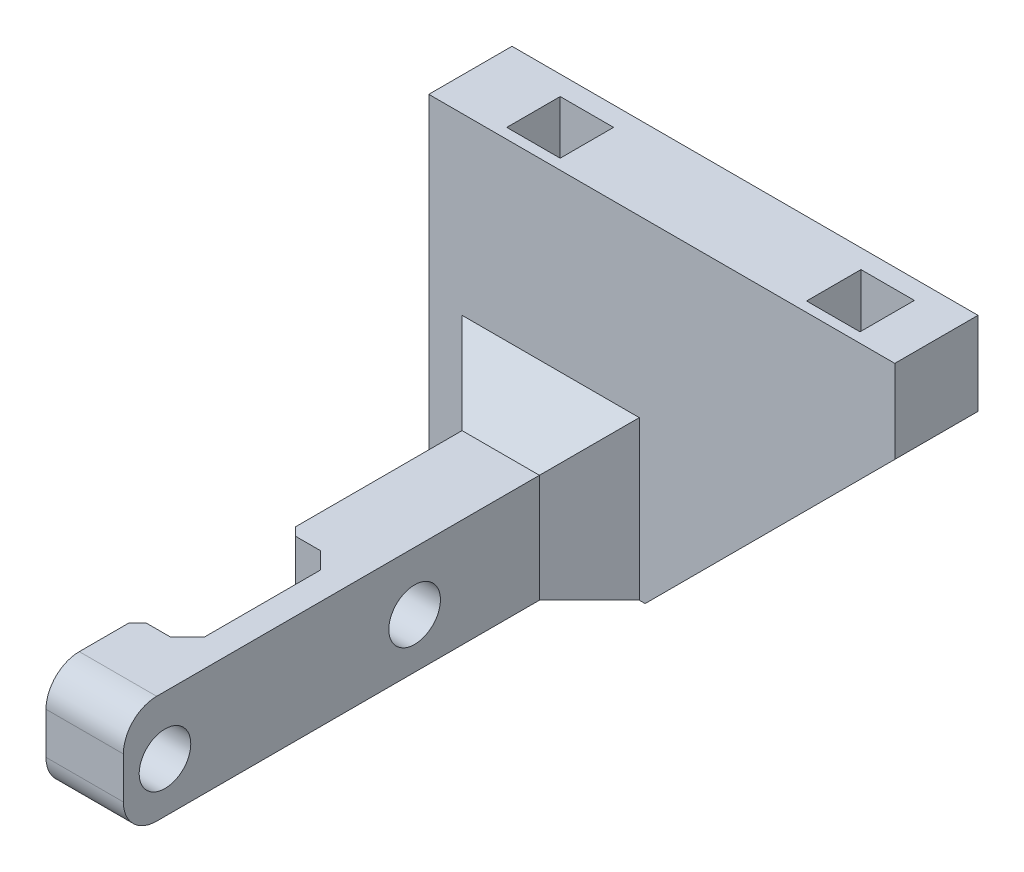
ISO-10303-21;
HEADER;
FILE_DESCRIPTION(('STEP AP214'),'2;1');
FILE_NAME('part.step','',(''),(''),'','','');
FILE_SCHEMA(('AUTOMOTIVE_DESIGN { 1 0 10303 214 1 1 1 1 }'));
ENDSEC;
DATA;
#1=APPLICATION_CONTEXT('core data for automotive mechanical design processes');
#2=APPLICATION_PROTOCOL_DEFINITION('international standard','automotive_design',2000,#1);
#3=PRODUCT_CONTEXT('',#1,'mechanical');
#4=PRODUCT('Part','Part','',(#3));
#5=PRODUCT_RELATED_PRODUCT_CATEGORY('part','',(#4));
#6=PRODUCT_DEFINITION_FORMATION('','',#4);
#7=PRODUCT_DEFINITION_CONTEXT('part definition',#1,'design');
#8=PRODUCT_DEFINITION('design','',#6,#7);
#9=PRODUCT_DEFINITION_SHAPE('','',#8);
#10=(LENGTH_UNIT() NAMED_UNIT(*) SI_UNIT(.MILLI.,.METRE.));
#11=(NAMED_UNIT(*) PLANE_ANGLE_UNIT() SI_UNIT($,.RADIAN.));
#12=(NAMED_UNIT(*) SI_UNIT($,.STERADIAN.) SOLID_ANGLE_UNIT());
#13=UNCERTAINTY_MEASURE_WITH_UNIT(LENGTH_MEASURE(1.E-05),#10,'distance_accuracy_value','');
#14=(GEOMETRIC_REPRESENTATION_CONTEXT(3) GLOBAL_UNCERTAINTY_ASSIGNED_CONTEXT((#13)) GLOBAL_UNIT_ASSIGNED_CONTEXT((#10,
#11,#12)) REPRESENTATION_CONTEXT('',''));
#15=CARTESIAN_POINT('',(0.,0.,0.));
#16=DIRECTION('',(0.,0.,1.));
#17=DIRECTION('',(1.,0.,0.));
#18=AXIS2_PLACEMENT_3D('',#15,#16,#17);
#19=CARTESIAN_POINT('',(0.,20.,0.));
#20=DIRECTION('',(0.,-1.,0.));
#21=DIRECTION('',(0.,0.,-1.));
#22=AXIS2_PLACEMENT_3D('',#19,#20,#21);
#23=PLANE('',#22);
#24=DIRECTION('',(0.,0.,-1.));
#25=VECTOR('',#24,1.);
#26=CARTESIAN_POINT('',(7.27200254201889,20.,0.));
#27=LINE('',#26,#25);
#28=CARTESIAN_POINT('',(7.27200254201889,20.,-0.621999824792119));
#29=VERTEX_POINT('',#28);
#30=CARTESIAN_POINT('',(7.27200254201889,20.,-3.831999980472));
#31=VERTEX_POINT('',#30);
#32=EDGE_CURVE('E257',#29,#31,#27,.T.);
#33=ORIENTED_EDGE('',*,*,#32,.F.);
#34=DIRECTION('',(1.,0.,0.));
#35=VECTOR('',#34,1.);
#36=CARTESIAN_POINT('',(0.,20.,-0.621999824792119));
#37=LINE('',#36,#35);
#38=CARTESIAN_POINT('',(4.06400368213654,20.,-0.621999824792119));
#39=VERTEX_POINT('',#38);
#40=EDGE_CURVE('E52',#39,#29,#37,.T.);
#41=ORIENTED_EDGE('',*,*,#40,.F.);
#42=DIRECTION('',(0.,0.,-1.));
#43=VECTOR('',#42,1.);
#44=CARTESIAN_POINT('',(4.06400368213654,20.,0.));
#45=LINE('',#44,#43);
#46=CARTESIAN_POINT('',(4.06400368213654,20.,-3.831999980472));
#47=VERTEX_POINT('',#46);
#48=EDGE_CURVE('E248',#39,#47,#45,.T.);
#49=ORIENTED_EDGE('',*,*,#48,.T.);
#50=DIRECTION('',(1.,0.,0.));
#51=VECTOR('',#50,1.);
#52=CARTESIAN_POINT('',(0.,20.,-3.831999980472));
#53=LINE('',#52,#51);
#54=EDGE_CURVE('E251',#47,#31,#53,.T.);
#55=ORIENTED_EDGE('',*,*,#54,.T.);
#56=EDGE_LOOP('',(#33,#41,#49,#55));
#57=FACE_BOUND('',#56,.T.);
#58=DIRECTION('',(0.,0.,1.));
#59=VECTOR('',#58,1.);
#60=CARTESIAN_POINT('',(0.,20.,0.));
#61=LINE('',#60,#59);
#62=CARTESIAN_POINT('',(0.,20.,-5.));
#63=VERTEX_POINT('',#62);
#64=CARTESIAN_POINT('',(0.,20.,0.));
#65=VERTEX_POINT('',#64);
#66=EDGE_CURVE('E338',#63,#65,#61,.T.);
#67=ORIENTED_EDGE('',*,*,#66,.T.);
#68=DIRECTION('',(1.,0.,0.));
#69=VECTOR('',#68,1.);
#70=CARTESIAN_POINT('',(0.,20.,0.));
#71=LINE('',#70,#69);
#72=CARTESIAN_POINT('',(28.,20.,0.));
#73=VERTEX_POINT('',#72);
#74=EDGE_CURVE('E341',#65,#73,#71,.T.);
#75=ORIENTED_EDGE('',*,*,#74,.T.);
#76=DIRECTION('',(0.,0.,-1.));
#77=VECTOR('',#76,1.);
#78=CARTESIAN_POINT('',(28.,20.,0.));
#79=LINE('',#78,#77);
#80=CARTESIAN_POINT('',(28.,20.,-5.));
#81=VERTEX_POINT('',#80);
#82=EDGE_CURVE('E344',#73,#81,#79,.T.);
#83=ORIENTED_EDGE('',*,*,#82,.T.);
#84=DIRECTION('',(-1.,0.,0.));
#85=VECTOR('',#84,1.);
#86=CARTESIAN_POINT('',(0.,20.,-5.));
#87=LINE('',#86,#85);
#88=EDGE_CURVE('E346',#81,#63,#87,.T.);
#89=ORIENTED_EDGE('',*,*,#88,.T.);
#90=EDGE_LOOP('',(#67,#75,#83,#89));
#91=FACE_BOUND('',#90,.T.);
#92=DIRECTION('',(0.,0.,-1.));
#93=VECTOR('',#92,1.);
#94=CARTESIAN_POINT('',(22.104005074501,20.,0.));
#95=LINE('',#94,#93);
#96=CARTESIAN_POINT('',(22.104005074501,20.,-0.595999626815291));
#97=VERTEX_POINT('',#96);
#98=CARTESIAN_POINT('',(22.104005074501,20.,-3.86399987488982));
#99=VERTEX_POINT('',#98);
#100=EDGE_CURVE('E60',#97,#99,#95,.T.);
#101=ORIENTED_EDGE('',*,*,#100,.T.);
#102=DIRECTION('',(-1.,0.,0.));
#103=VECTOR('',#102,1.);
#104=CARTESIAN_POINT('',(0.,20.,-3.86399987488982));
#105=LINE('',#104,#103);
#106=CARTESIAN_POINT('',(25.3140006899834,20.,-3.86399987488982));
#107=VERTEX_POINT('',#106);
#108=EDGE_CURVE('E271',#107,#99,#105,.T.);
#109=ORIENTED_EDGE('',*,*,#108,.F.);
#110=DIRECTION('',(0.,0.,-1.));
#111=VECTOR('',#110,1.);
#112=CARTESIAN_POINT('',(25.3140006899834,20.,0.));
#113=LINE('',#112,#111);
#114=CARTESIAN_POINT('',(25.3140006899834,20.,-0.595999626815292));
#115=VERTEX_POINT('',#114);
#116=EDGE_CURVE('E284',#115,#107,#113,.T.);
#117=ORIENTED_EDGE('',*,*,#116,.F.);
#118=DIRECTION('',(-1.,0.,0.));
#119=VECTOR('',#118,1.);
#120=CARTESIAN_POINT('',(0.,20.,-0.595999626815288));
#121=LINE('',#120,#119);
#122=EDGE_CURVE('E281',#115,#97,#121,.T.);
#123=ORIENTED_EDGE('',*,*,#122,.T.);
#124=EDGE_LOOP('',(#101,#109,#117,#123));
#125=FACE_BOUND('',#124,.T.);
#126=ADVANCED_FACE('F36',(#57,#91,#125),#23,.F.);
#127=CARTESIAN_POINT('',(5.,0.,28.));
#128=DIRECTION('',(1.,0.,0.));
#129=DIRECTION('',(0.,0.,-1.));
#130=AXIS2_PLACEMENT_3D('',#127,#128,#129);
#131=PLANE('',#130);
#132=CARTESIAN_POINT('',(5.,2.99999999999998,25.5));
#133=DIRECTION('',(-1.,0.,0.));
#134=DIRECTION('',(0.,0.,1.));
#135=AXIS2_PLACEMENT_3D('',#132,#133,#134);
#136=CIRCLE('',#135,1.55);
#137=CARTESIAN_POINT('',(5.,2.99999999999998,27.05));
#138=VERTEX_POINT('',#137);
#139=EDGE_CURVE('E295',#138,#138,#136,.T.);
#140=ORIENTED_EDGE('',*,*,#139,.F.);
#141=EDGE_LOOP('',(#140));
#142=FACE_BOUND('',#141,.T.);
#143=DIRECTION('',(0.,0.,-1.));
#144=VECTOR('',#143,1.);
#145=CARTESIAN_POINT('',(5.,6.5,28.));
#146=LINE('',#145,#144);
#147=CARTESIAN_POINT('',(5.,6.5,26.));
#148=VERTEX_POINT('',#147);
#149=CARTESIAN_POINT('',(5.,6.5,23.));
#150=VERTEX_POINT('',#149);
#151=EDGE_CURVE('E331',#148,#150,#146,.T.);
#152=ORIENTED_EDGE('',*,*,#151,.T.);
#153=DIRECTION('',(0.,-1.,0.));
#154=VECTOR('',#153,1.);
#155=CARTESIAN_POINT('',(5.,0.,23.));
#156=LINE('',#155,#154);
#157=CARTESIAN_POINT('',(5.00000000000001,0.,23.));
#158=VERTEX_POINT('',#157);
#159=EDGE_CURVE('E418',#150,#158,#156,.T.);
#160=ORIENTED_EDGE('',*,*,#159,.T.);
#161=DIRECTION('',(0.,0.,-1.));
#162=VECTOR('',#161,1.);
#163=CARTESIAN_POINT('',(5.00000000000001,0.,28.));
#164=LINE('',#163,#162);
#165=CARTESIAN_POINT('',(5.00000000000001,0.,26.));
#166=VERTEX_POINT('',#165);
#167=EDGE_CURVE('E327',#166,#158,#164,.T.);
#168=ORIENTED_EDGE('',*,*,#167,.F.);
#169=CARTESIAN_POINT('',(5.,2.,26.));
#170=DIRECTION('',(1.,0.,0.));
#171=DIRECTION('',(0.,0.,-1.));
#172=AXIS2_PLACEMENT_3D('',#169,#170,#171);
#173=CIRCLE('',#172,2.);
#174=CARTESIAN_POINT('',(5.,2.,28.));
#175=VERTEX_POINT('',#174);
#176=EDGE_CURVE('E412',#166,#175,#173,.F.);
#177=ORIENTED_EDGE('',*,*,#176,.T.);
#178=DIRECTION('',(0.,-1.,0.));
#179=VECTOR('',#178,1.);
#180=CARTESIAN_POINT('',(5.,0.,28.));
#181=LINE('',#180,#179);
#182=CARTESIAN_POINT('',(5.,4.5,28.));
#183=VERTEX_POINT('',#182);
#184=EDGE_CURVE('E320',#183,#175,#181,.T.);
#185=ORIENTED_EDGE('',*,*,#184,.F.);
#186=CARTESIAN_POINT('',(5.,4.5,26.));
#187=DIRECTION('',(1.,0.,0.));
#188=DIRECTION('',(0.,0.,-1.));
#189=AXIS2_PLACEMENT_3D('',#186,#187,#188);
#190=CIRCLE('',#189,2.);
#191=EDGE_CURVE('E414',#183,#148,#190,.F.);
#192=ORIENTED_EDGE('',*,*,#191,.T.);
#193=EDGE_LOOP('',(#152,#160,#168,#177,#185,#192));
#194=FACE_BOUND('',#193,.T.);
#195=ADVANCED_FACE('F517',(#142,#194),#131,.F.);
#196=CARTESIAN_POINT('',(0.,20.,0.));
#197=DIRECTION('',(1.,0.,0.));
#198=DIRECTION('',(0.,0.,-1.));
#199=AXIS2_PLACEMENT_3D('',#196,#197,#198);
#200=PLANE('',#199);
#201=DIRECTION('',(0.,0.,1.));
#202=VECTOR('',#201,1.);
#203=CARTESIAN_POINT('',(0.,0.,0.));
#204=LINE('',#203,#202);
#205=CARTESIAN_POINT('',(0.,0.,-5.));
#206=VERTEX_POINT('',#205);
#207=CARTESIAN_POINT('',(0.,0.,0.));
#208=VERTEX_POINT('',#207);
#209=EDGE_CURVE('E337',#206,#208,#204,.T.);
#210=ORIENTED_EDGE('',*,*,#209,.T.);
#211=DIRECTION('',(0.,-1.,0.));
#212=VECTOR('',#211,1.);
#213=CARTESIAN_POINT('',(0.,20.,0.));
#214=LINE('',#213,#212);
#215=EDGE_CURVE('E364',#65,#208,#214,.T.);
#216=ORIENTED_EDGE('',*,*,#215,.F.);
#217=ORIENTED_EDGE('',*,*,#66,.F.);
#218=DIRECTION('',(0.,-1.,0.));
#219=VECTOR('',#218,1.);
#220=CARTESIAN_POINT('',(0.,20.,-5.));
#221=LINE('',#220,#219);
#222=EDGE_CURVE('E348',#63,#206,#221,.T.);
#223=ORIENTED_EDGE('',*,*,#222,.T.);
#224=EDGE_LOOP('',(#210,#216,#217,#223));
#225=FACE_BOUND('',#224,.T.);
#226=ADVANCED_FACE('F546',(#225),#200,.F.);
#227=CARTESIAN_POINT('',(0.,20.,0.));
#228=DIRECTION('',(0.,0.,-1.));
#229=DIRECTION('',(-1.,0.,0.));
#230=AXIS2_PLACEMENT_3D('',#227,#228,#229);
#231=PLANE('',#230);
#232=DIRECTION('',(1.,0.,0.));
#233=VECTOR('',#232,1.);
#234=CARTESIAN_POINT('',(0.,9.50000000000002,0.));
#235=LINE('',#234,#233);
#236=CARTESIAN_POINT('',(2.00000000000002,9.50000000000002,0.));
#237=VERTEX_POINT('',#236);
#238=CARTESIAN_POINT('',(12.6487572971,9.50000000000002,0.));
#239=VERTEX_POINT('',#238);
#240=EDGE_CURVE('E453',#237,#239,#235,.T.);
#241=ORIENTED_EDGE('',*,*,#240,.T.);
#242=DIRECTION('',(0.,-1.,0.));
#243=VECTOR('',#242,1.);
#244=CARTESIAN_POINT('',(12.6487572971,20.,0.));
#245=LINE('',#244,#243);
#246=CARTESIAN_POINT('',(12.6487572971,0.,0.));
#247=VERTEX_POINT('',#246);
#248=EDGE_CURVE('E441',#239,#247,#245,.T.);
#249=ORIENTED_EDGE('',*,*,#248,.T.);
#250=DIRECTION('',(1.,0.,0.));
#251=VECTOR('',#250,1.);
#252=CARTESIAN_POINT('',(0.,0.,0.));
#253=LINE('',#252,#251);
#254=CARTESIAN_POINT('',(13.,0.,0.));
#255=VERTEX_POINT('',#254);
#256=EDGE_CURVE('E351',#247,#255,#253,.T.);
#257=ORIENTED_EDGE('',*,*,#256,.T.);
#258=DIRECTION('',(0.707106781186549,0.707106781186546,0.));
#259=VECTOR('',#258,1.);
#260=CARTESIAN_POINT('',(28.,15.,0.));
#261=LINE('',#260,#259);
#262=CARTESIAN_POINT('',(28.,15.,0.));
#263=VERTEX_POINT('',#262);
#264=EDGE_CURVE('E375',#255,#263,#261,.T.);
#265=ORIENTED_EDGE('',*,*,#264,.T.);
#266=DIRECTION('',(0.,-1.,0.));
#267=VECTOR('',#266,1.);
#268=CARTESIAN_POINT('',(28.,20.,0.));
#269=LINE('',#268,#267);
#270=EDGE_CURVE('E361',#73,#263,#269,.T.);
#271=ORIENTED_EDGE('',*,*,#270,.F.);
#272=ORIENTED_EDGE('',*,*,#74,.F.);
#273=ORIENTED_EDGE('',*,*,#215,.T.);
#274=CARTESIAN_POINT('',(2.00000000000002,0.,0.));
#275=VERTEX_POINT('',#274);
#276=EDGE_CURVE('E352',#208,#275,#253,.T.);
#277=ORIENTED_EDGE('',*,*,#276,.T.);
#278=DIRECTION('',(0.,1.,0.));
#279=VECTOR('',#278,1.);
#280=CARTESIAN_POINT('',(2.00000000000002,6.5,0.));
#281=LINE('',#280,#279);
#282=EDGE_CURVE('E444',#275,#237,#281,.T.);
#283=ORIENTED_EDGE('',*,*,#282,.T.);
#284=EDGE_LOOP('',(#241,#249,#257,#265,#271,#272,#273,#277,#283));
#285=FACE_BOUND('',#284,.T.);
#286=ADVANCED_FACE('F563',(#285),#231,.F.);
#287=CARTESIAN_POINT('',(28.,20.,0.));
#288=DIRECTION('',(-1.,0.,0.));
#289=DIRECTION('',(0.,0.,1.));
#290=AXIS2_PLACEMENT_3D('',#287,#288,#289);
#291=PLANE('',#290);
#292=ORIENTED_EDGE('',*,*,#270,.T.);
#293=DIRECTION('',(0.,0.,-1.));
#294=VECTOR('',#293,1.);
#295=CARTESIAN_POINT('',(28.,15.,-5.));
#296=LINE('',#295,#294);
#297=CARTESIAN_POINT('',(28.,15.,-5.));
#298=VERTEX_POINT('',#297);
#299=EDGE_CURVE('E367',#263,#298,#296,.T.);
#300=ORIENTED_EDGE('',*,*,#299,.T.);
#301=DIRECTION('',(0.,-1.,0.));
#302=VECTOR('',#301,1.);
#303=CARTESIAN_POINT('',(28.,20.,-5.));
#304=LINE('',#303,#302);
#305=EDGE_CURVE('E358',#81,#298,#304,.T.);
#306=ORIENTED_EDGE('',*,*,#305,.F.);
#307=ORIENTED_EDGE('',*,*,#82,.F.);
#308=EDGE_LOOP('',(#292,#300,#306,#307));
#309=FACE_BOUND('',#308,.T.);
#310=ADVANCED_FACE('F559',(#309),#291,.F.);
#311=CARTESIAN_POINT('',(0.,20.,-5.));
#312=DIRECTION('',(0.,0.,1.));
#313=DIRECTION('',(1.,0.,0.));
#314=AXIS2_PLACEMENT_3D('',#311,#312,#313);
#315=PLANE('',#314);
#316=ORIENTED_EDGE('',*,*,#305,.T.);
#317=DIRECTION('',(-0.707106781186549,-0.707106781186546,0.));
#318=VECTOR('',#317,1.);
#319=CARTESIAN_POINT('',(28.,15.,-5.));
#320=LINE('',#319,#318);
#321=CARTESIAN_POINT('',(13.,0.,-5.));
#322=VERTEX_POINT('',#321);
#323=EDGE_CURVE('E370',#298,#322,#320,.T.);
#324=ORIENTED_EDGE('',*,*,#323,.T.);
#325=DIRECTION('',(-1.,0.,0.));
#326=VECTOR('',#325,1.);
#327=CARTESIAN_POINT('',(0.,0.,-5.));
#328=LINE('',#327,#326);
#329=EDGE_CURVE('E342',#322,#206,#328,.T.);
#330=ORIENTED_EDGE('',*,*,#329,.T.);
#331=ORIENTED_EDGE('',*,*,#222,.F.);
#332=ORIENTED_EDGE('',*,*,#88,.F.);
#333=EDGE_LOOP('',(#316,#324,#330,#331,#332));
#334=FACE_BOUND('',#333,.T.);
#335=ADVANCED_FACE('F556',(#334),#315,.F.);
#336=CARTESIAN_POINT('',(0.,0.,0.));
#337=DIRECTION('',(0.,-1.,0.));
#338=DIRECTION('',(0.,0.,-1.));
#339=AXIS2_PLACEMENT_3D('',#336,#337,#338);
#340=PLANE('',#339);
#341=ORIENTED_EDGE('',*,*,#167,.T.);
#342=DIRECTION('',(-0.707106781186552,0.,0.707106781186543));
#343=VECTOR('',#342,1.);
#344=CARTESIAN_POINT('',(14.,0.,14.0000000000002));
#345=LINE('',#344,#343);
#346=CARTESIAN_POINT('',(5.50000000000001,0.,22.5));
#347=VERTEX_POINT('',#346);
#348=EDGE_CURVE('E423',#158,#347,#345,.F.);
#349=ORIENTED_EDGE('',*,*,#348,.T.);
#350=DIRECTION('',(-1.,0.,0.));
#351=VECTOR('',#350,1.);
#352=CARTESIAN_POINT('',(5.00000000000001,0.,22.5));
#353=LINE('',#352,#351);
#354=CARTESIAN_POINT('',(7.,0.,22.5));
#355=VERTEX_POINT('',#354);
#356=EDGE_CURVE('E309',#355,#347,#353,.T.);
#357=ORIENTED_EDGE('',*,*,#356,.F.);
#358=DIRECTION('',(-0.70710678118655,0.,0.707106781186545));
#359=VECTOR('',#358,1.);
#360=CARTESIAN_POINT('',(7.,0.,22.5));
#361=LINE('',#360,#359);
#362=CARTESIAN_POINT('',(8.00000000000001,0.,21.5));
#363=VERTEX_POINT('',#362);
#364=EDGE_CURVE('E395',#355,#363,#361,.F.);
#365=ORIENTED_EDGE('',*,*,#364,.T.);
#366=DIRECTION('',(0.,0.,1.));
#367=VECTOR('',#366,1.);
#368=CARTESIAN_POINT('',(8.00000000000001,0.,22.5));
#369=LINE('',#368,#367);
#370=CARTESIAN_POINT('',(8.00000000000001,0.,14.5));
#371=VERTEX_POINT('',#370);
#372=EDGE_CURVE('E306',#371,#363,#369,.T.);
#373=ORIENTED_EDGE('',*,*,#372,.F.);
#374=DIRECTION('',(0.707106781186545,0.,0.70710678118655));
#375=VECTOR('',#374,1.);
#376=CARTESIAN_POINT('',(8.00000000000001,0.,14.5));
#377=LINE('',#376,#375);
#378=CARTESIAN_POINT('',(7.00000000000001,0.,13.5));
#379=VERTEX_POINT('',#378);
#380=EDGE_CURVE('E390',#371,#379,#377,.F.);
#381=ORIENTED_EDGE('',*,*,#380,.T.);
#382=DIRECTION('',(1.,0.,0.));
#383=VECTOR('',#382,1.);
#384=CARTESIAN_POINT('',(5.00000000000001,0.,13.5));
#385=LINE('',#384,#383);
#386=CARTESIAN_POINT('',(5.50000000000001,0.,13.5));
#387=VERTEX_POINT('',#386);
#388=EDGE_CURVE('E304',#387,#379,#385,.T.);
#389=ORIENTED_EDGE('',*,*,#388,.F.);
#390=DIRECTION('',(0.707106781186548,0.,0.707106781186548));
#391=VECTOR('',#390,1.);
#392=CARTESIAN_POINT('',(-4.,0.,4.));
#393=LINE('',#392,#391);
#394=CARTESIAN_POINT('',(5.00000000000001,0.,13.));
#395=VERTEX_POINT('',#394);
#396=EDGE_CURVE('E421',#387,#395,#393,.F.);
#397=ORIENTED_EDGE('',*,*,#396,.T.);
#398=CARTESIAN_POINT('',(5.00000000000001,0.,3.00000000000002));
#399=VERTEX_POINT('',#398);
#400=EDGE_CURVE('E326',#395,#399,#164,.T.);
#401=ORIENTED_EDGE('',*,*,#400,.T.);
#402=DIRECTION('',(0.707106781186543,0.,0.707106781186552));
#403=VECTOR('',#402,1.);
#404=CARTESIAN_POINT('',(5.,0.,3.00000000000002));
#405=LINE('',#404,#403);
#406=EDGE_CURVE('E449',#399,#275,#405,.F.);
#407=ORIENTED_EDGE('',*,*,#406,.T.);
#408=ORIENTED_EDGE('',*,*,#276,.F.);
#409=ORIENTED_EDGE('',*,*,#209,.F.);
#410=ORIENTED_EDGE('',*,*,#329,.F.);
#411=DIRECTION('',(0.,0.,1.));
#412=VECTOR('',#411,1.);
#413=CARTESIAN_POINT('',(13.,0.,0.));
#414=LINE('',#413,#412);
#415=EDGE_CURVE('E372',#322,#255,#414,.T.);
#416=ORIENTED_EDGE('',*,*,#415,.T.);
#417=ORIENTED_EDGE('',*,*,#256,.F.);
#418=DIRECTION('',(-0.707106781186552,0.,0.707106781186543));
#419=VECTOR('',#418,1.);
#420=CARTESIAN_POINT('',(12.6487572971,0.,0.));
#421=LINE('',#420,#419);
#422=CARTESIAN_POINT('',(9.64875729710002,0.,2.99999999999999));
#423=VERTEX_POINT('',#422);
#424=EDGE_CURVE('E451',#247,#423,#421,.T.);
#425=ORIENTED_EDGE('',*,*,#424,.T.);
#426=DIRECTION('',(0.,0.,-1.));
#427=VECTOR('',#426,1.);
#428=CARTESIAN_POINT('',(9.64875729710002,0.,28.));
#429=LINE('',#428,#427);
#430=CARTESIAN_POINT('',(9.64875729710002,0.,26.));
#431=VERTEX_POINT('',#430);
#432=EDGE_CURVE('E323',#431,#423,#429,.T.);
#433=ORIENTED_EDGE('',*,*,#432,.F.);
#434=DIRECTION('',(1.,0.,0.));
#435=VECTOR('',#434,1.);
#436=CARTESIAN_POINT('',(0.,0.,26.));
#437=LINE('',#436,#435);
#438=EDGE_CURVE('E416',#431,#166,#437,.F.);
#439=ORIENTED_EDGE('',*,*,#438,.T.);
#440=EDGE_LOOP('',(#341,#349,#357,#365,#373,#381,#389,#397,#401,#407,#408,#409,#410,#416,#417,
#425,#433,#439));
#441=FACE_BOUND('',#440,.T.);
#442=ADVANCED_FACE('F485',(#441),#340,.T.);
#443=CARTESIAN_POINT('',(28.,15.,0.));
#444=DIRECTION('',(0.707106781186546,-0.707106781186549,0.));
#445=DIRECTION('',(0.,0.,1.));
#446=AXIS2_PLACEMENT_3D('',#443,#444,#445);
#447=PLANE('',#446);
#448=ORIENTED_EDGE('',*,*,#264,.F.);
#449=ORIENTED_EDGE('',*,*,#415,.F.);
#450=ORIENTED_EDGE('',*,*,#323,.F.);
#451=ORIENTED_EDGE('',*,*,#299,.F.);
#452=EDGE_LOOP('',(#448,#449,#450,#451));
#453=FACE_BOUND('',#452,.T.);
#454=ADVANCED_FACE('F555',(#453),#447,.T.);
#455=CARTESIAN_POINT('',(9.64875729710002,0.,28.));
#456=DIRECTION('',(1.,0.,0.));
#457=DIRECTION('',(0.,0.,-1.));
#458=AXIS2_PLACEMENT_3D('',#455,#456,#457);
#459=PLANE('',#458);
#460=CARTESIAN_POINT('',(9.64875729710002,2.99999999999998,25.5));
#461=DIRECTION('',(1.,0.,0.));
#462=DIRECTION('',(0.,0.,-1.));
#463=AXIS2_PLACEMENT_3D('',#460,#461,#462);
#464=CIRCLE('',#463,1.55);
#465=CARTESIAN_POINT('',(9.64875729710002,2.99999999999998,23.95));
#466=VERTEX_POINT('',#465);
#467=EDGE_CURVE('E303',#466,#466,#464,.T.);
#468=ORIENTED_EDGE('',*,*,#467,.F.);
#469=EDGE_LOOP('',(#468));
#470=FACE_BOUND('',#469,.T.);
#471=CARTESIAN_POINT('',(9.64875729710002,2.99999999999998,10.5));
#472=DIRECTION('',(1.,0.,0.));
#473=DIRECTION('',(0.,0.,-1.));
#474=AXIS2_PLACEMENT_3D('',#471,#472,#473);
#475=CIRCLE('',#474,1.55);
#476=CARTESIAN_POINT('',(9.64875729710002,2.99999999999998,8.95));
#477=VERTEX_POINT('',#476);
#478=EDGE_CURVE('E298',#477,#477,#475,.T.);
#479=ORIENTED_EDGE('',*,*,#478,.F.);
#480=EDGE_LOOP('',(#479));
#481=FACE_BOUND('',#480,.T.);
#482=ORIENTED_EDGE('',*,*,#432,.T.);
#483=DIRECTION('',(0.,1.,0.));
#484=VECTOR('',#483,1.);
#485=CARTESIAN_POINT('',(9.64875729710002,0.,2.99999999999999));
#486=LINE('',#485,#484);
#487=CARTESIAN_POINT('',(9.64875729710002,6.5,2.99999999999999));
#488=VERTEX_POINT('',#487);
#489=EDGE_CURVE('E446',#423,#488,#486,.T.);
#490=ORIENTED_EDGE('',*,*,#489,.T.);
#491=DIRECTION('',(0.,0.,-1.));
#492=VECTOR('',#491,1.);
#493=CARTESIAN_POINT('',(9.64875729710002,6.5,28.));
#494=LINE('',#493,#492);
#495=CARTESIAN_POINT('',(9.64875729710002,6.5,26.));
#496=VERTEX_POINT('',#495);
#497=EDGE_CURVE('E334',#496,#488,#494,.T.);
#498=ORIENTED_EDGE('',*,*,#497,.F.);
#499=CARTESIAN_POINT('',(9.64875729710002,4.5,26.));
#500=DIRECTION('',(1.,0.,0.));
#501=DIRECTION('',(0.,0.,-1.));
#502=AXIS2_PLACEMENT_3D('',#499,#500,#501);
#503=CIRCLE('',#502,2.);
#504=CARTESIAN_POINT('',(9.64875729710002,4.5,28.));
#505=VERTEX_POINT('',#504);
#506=EDGE_CURVE('E405',#496,#505,#503,.T.);
#507=ORIENTED_EDGE('',*,*,#506,.T.);
#508=DIRECTION('',(0.,-1.,0.));
#509=VECTOR('',#508,1.);
#510=CARTESIAN_POINT('',(9.64875729710002,0.,28.));
#511=LINE('',#510,#509);
#512=CARTESIAN_POINT('',(9.64875729710002,2.,28.));
#513=VERTEX_POINT('',#512);
#514=EDGE_CURVE('E317',#505,#513,#511,.T.);
#515=ORIENTED_EDGE('',*,*,#514,.T.);
#516=CARTESIAN_POINT('',(9.64875729710002,2.,26.));
#517=DIRECTION('',(1.,0.,0.));
#518=DIRECTION('',(0.,0.,-1.));
#519=AXIS2_PLACEMENT_3D('',#516,#517,#518);
#520=CIRCLE('',#519,2.);
#521=EDGE_CURVE('E403',#513,#431,#520,.T.);
#522=ORIENTED_EDGE('',*,*,#521,.T.);
#523=EDGE_LOOP('',(#482,#490,#498,#507,#515,#522));
#524=FACE_BOUND('',#523,.T.);
#525=ADVANCED_FACE('F466',(#470,#481,#524),#459,.T.);
#526=CARTESIAN_POINT('',(0.,6.5,28.));
#527=DIRECTION('',(0.,1.,0.));
#528=DIRECTION('',(0.,0.,1.));
#529=AXIS2_PLACEMENT_3D('',#526,#527,#528);
#530=PLANE('',#529);
#531=ORIENTED_EDGE('',*,*,#497,.T.);
#532=DIRECTION('',(-1.,0.,0.));
#533=VECTOR('',#532,1.);
#534=CARTESIAN_POINT('',(0.,6.5,2.99999999999998));
#535=LINE('',#534,#533);
#536=CARTESIAN_POINT('',(5.,6.5,3.00000000000002));
#537=VERTEX_POINT('',#536);
#538=EDGE_CURVE('E456',#488,#537,#535,.T.);
#539=ORIENTED_EDGE('',*,*,#538,.T.);
#540=CARTESIAN_POINT('',(5.,6.5,13.));
#541=VERTEX_POINT('',#540);
#542=EDGE_CURVE('E330',#541,#537,#146,.T.);
#543=ORIENTED_EDGE('',*,*,#542,.F.);
#544=DIRECTION('',(-0.707106781186548,0.,-0.707106781186548));
#545=VECTOR('',#544,1.);
#546=CARTESIAN_POINT('',(10.,6.5,18.));
#547=LINE('',#546,#545);
#548=CARTESIAN_POINT('',(5.50000000000001,6.5,13.5));
#549=VERTEX_POINT('',#548);
#550=EDGE_CURVE('E427',#541,#549,#547,.F.);
#551=ORIENTED_EDGE('',*,*,#550,.T.);
#552=DIRECTION('',(-1.,0.,0.));
#553=VECTOR('',#552,1.);
#554=CARTESIAN_POINT('',(0.,6.5,13.5));
#555=LINE('',#554,#553);
#556=CARTESIAN_POINT('',(7.00000000000001,6.5,13.5));
#557=VERTEX_POINT('',#556);
#558=EDGE_CURVE('E312',#557,#549,#555,.T.);
#559=ORIENTED_EDGE('',*,*,#558,.F.);
#560=DIRECTION('',(-0.707106781186545,0.,-0.70710678118655));
#561=VECTOR('',#560,1.);
#562=CARTESIAN_POINT('',(8.00000000000001,6.5,14.5));
#563=LINE('',#562,#561);
#564=CARTESIAN_POINT('',(8.00000000000001,6.5,14.5));
#565=VERTEX_POINT('',#564);
#566=EDGE_CURVE('E393',#557,#565,#563,.F.);
#567=ORIENTED_EDGE('',*,*,#566,.T.);
#568=DIRECTION('',(0.,0.,-1.));
#569=VECTOR('',#568,1.);
#570=CARTESIAN_POINT('',(8.,6.5,28.));
#571=LINE('',#570,#569);
#572=CARTESIAN_POINT('',(8.00000000000001,6.5,21.5));
#573=VERTEX_POINT('',#572);
#574=EDGE_CURVE('E377',#573,#565,#571,.T.);
#575=ORIENTED_EDGE('',*,*,#574,.F.);
#576=DIRECTION('',(0.70710678118655,0.,-0.707106781186545));
#577=VECTOR('',#576,1.);
#578=CARTESIAN_POINT('',(7.,6.5,22.5));
#579=LINE('',#578,#577);
#580=CARTESIAN_POINT('',(7.,6.5,22.5));
#581=VERTEX_POINT('',#580);
#582=EDGE_CURVE('E397',#573,#581,#579,.F.);
#583=ORIENTED_EDGE('',*,*,#582,.T.);
#584=DIRECTION('',(1.,0.,0.));
#585=VECTOR('',#584,1.);
#586=CARTESIAN_POINT('',(0.,6.5,22.5));
#587=LINE('',#586,#585);
#588=CARTESIAN_POINT('',(5.50000000000001,6.5,22.5));
#589=VERTEX_POINT('',#588);
#590=EDGE_CURVE('E315',#589,#581,#587,.T.);
#591=ORIENTED_EDGE('',*,*,#590,.F.);
#592=DIRECTION('',(0.707106781186552,0.,-0.707106781186543));
#593=VECTOR('',#592,1.);
#594=CARTESIAN_POINT('',(0.,6.5,28.));
#595=LINE('',#594,#593);
#596=EDGE_CURVE('E429',#589,#150,#595,.F.);
#597=ORIENTED_EDGE('',*,*,#596,.T.);
#598=ORIENTED_EDGE('',*,*,#151,.F.);
#599=DIRECTION('',(1.,0.,0.));
#600=VECTOR('',#599,1.);
#601=CARTESIAN_POINT('',(0.,6.5,26.));
#602=LINE('',#601,#600);
#603=EDGE_CURVE('E400',#148,#496,#602,.T.);
#604=ORIENTED_EDGE('',*,*,#603,.T.);
#605=EDGE_LOOP('',(#531,#539,#543,#551,#559,#567,#575,#583,#591,#597,#598,#604));
#606=FACE_BOUND('',#605,.T.);
#607=ADVANCED_FACE('F469',(#606),#530,.T.);
#608=CARTESIAN_POINT('',(5.,2.99999999999998,10.5));
#609=DIRECTION('',(-1.,0.,0.));
#610=DIRECTION('',(0.,0.,1.));
#611=AXIS2_PLACEMENT_3D('',#608,#609,#610);
#612=CIRCLE('',#611,1.55);
#613=CARTESIAN_POINT('',(5.,2.99999999999998,12.05));
#614=VERTEX_POINT('',#613);
#615=EDGE_CURVE('E264',#614,#614,#612,.T.);
#616=ORIENTED_EDGE('',*,*,#615,.F.);
#617=EDGE_LOOP('',(#616));
#618=FACE_BOUND('',#617,.T.);
#619=ORIENTED_EDGE('',*,*,#542,.T.);
#620=DIRECTION('',(0.,-1.,0.));
#621=VECTOR('',#620,1.);
#622=CARTESIAN_POINT('',(5.,0.,3.00000000000002));
#623=LINE('',#622,#621);
#624=EDGE_CURVE('E436',#537,#399,#623,.T.);
#625=ORIENTED_EDGE('',*,*,#624,.T.);
#626=ORIENTED_EDGE('',*,*,#400,.F.);
#627=DIRECTION('',(0.,1.,0.));
#628=VECTOR('',#627,1.);
#629=CARTESIAN_POINT('',(5.,0.,13.));
#630=LINE('',#629,#628);
#631=EDGE_CURVE('E431',#395,#541,#630,.T.);
#632=ORIENTED_EDGE('',*,*,#631,.T.);
#633=EDGE_LOOP('',(#619,#625,#626,#632));
#634=FACE_BOUND('',#633,.T.);
#635=ADVANCED_FACE('F482',(#618,#634),#131,.F.);
#636=CARTESIAN_POINT('',(0.,0.,28.));
#637=DIRECTION('',(0.,0.,1.));
#638=DIRECTION('',(1.,0.,0.));
#639=AXIS2_PLACEMENT_3D('',#636,#637,#638);
#640=PLANE('',#639);
#641=ORIENTED_EDGE('',*,*,#514,.F.);
#642=DIRECTION('',(1.,0.,0.));
#643=VECTOR('',#642,1.);
#644=CARTESIAN_POINT('',(0.,4.5,28.));
#645=LINE('',#644,#643);
#646=EDGE_CURVE('E410',#505,#183,#645,.F.);
#647=ORIENTED_EDGE('',*,*,#646,.T.);
#648=ORIENTED_EDGE('',*,*,#184,.T.);
#649=DIRECTION('',(1.,0.,0.));
#650=VECTOR('',#649,1.);
#651=CARTESIAN_POINT('',(0.,2.,28.));
#652=LINE('',#651,#650);
#653=EDGE_CURVE('E407',#175,#513,#652,.T.);
#654=ORIENTED_EDGE('',*,*,#653,.T.);
#655=EDGE_LOOP('',(#641,#647,#648,#654));
#656=FACE_BOUND('',#655,.T.);
#657=ADVANCED_FACE('F528',(#656),#640,.T.);
#658=CARTESIAN_POINT('',(5.00000000000001,12.8,22.5));
#659=DIRECTION('',(0.,0.,1.));
#660=DIRECTION('',(1.,0.,0.));
#661=AXIS2_PLACEMENT_3D('',#658,#659,#660);
#662=PLANE('',#661);
#663=ORIENTED_EDGE('',*,*,#356,.T.);
#664=DIRECTION('',(0.,1.,0.));
#665=VECTOR('',#664,1.);
#666=CARTESIAN_POINT('',(5.50000000000001,12.8,22.5));
#667=LINE('',#666,#665);
#668=EDGE_CURVE('E425',#347,#589,#667,.T.);
#669=ORIENTED_EDGE('',*,*,#668,.T.);
#670=ORIENTED_EDGE('',*,*,#590,.T.);
#671=DIRECTION('',(0.,-1.,0.));
#672=VECTOR('',#671,1.);
#673=CARTESIAN_POINT('',(7.,0.,22.5));
#674=LINE('',#673,#672);
#675=EDGE_CURVE('E387',#581,#355,#674,.T.);
#676=ORIENTED_EDGE('',*,*,#675,.T.);
#677=EDGE_LOOP('',(#663,#669,#670,#676));
#678=FACE_BOUND('',#677,.T.);
#679=ADVANCED_FACE('F623',(#678),#662,.F.);
#680=CARTESIAN_POINT('',(8.00000000000001,12.8,22.5));
#681=DIRECTION('',(1.,0.,0.));
#682=DIRECTION('',(0.,0.,-1.));
#683=AXIS2_PLACEMENT_3D('',#680,#681,#682);
#684=PLANE('',#683);
#685=ORIENTED_EDGE('',*,*,#574,.T.);
#686=DIRECTION('',(0.,-1.,0.));
#687=VECTOR('',#686,1.);
#688=CARTESIAN_POINT('',(8.00000000000001,0.,14.5));
#689=LINE('',#688,#687);
#690=EDGE_CURVE('E382',#565,#371,#689,.T.);
#691=ORIENTED_EDGE('',*,*,#690,.T.);
#692=ORIENTED_EDGE('',*,*,#372,.T.);
#693=DIRECTION('',(0.,1.,0.));
#694=VECTOR('',#693,1.);
#695=CARTESIAN_POINT('',(8.00000000000001,6.5,21.5));
#696=LINE('',#695,#694);
#697=EDGE_CURVE('E380',#363,#573,#696,.T.);
#698=ORIENTED_EDGE('',*,*,#697,.T.);
#699=EDGE_LOOP('',(#685,#691,#692,#698));
#700=FACE_BOUND('',#699,.T.);
#701=ADVANCED_FACE('F502',(#700),#684,.F.);
#702=CARTESIAN_POINT('',(5.00000000000001,12.8,13.5));
#703=DIRECTION('',(0.,0.,-1.));
#704=DIRECTION('',(-1.,0.,0.));
#705=AXIS2_PLACEMENT_3D('',#702,#703,#704);
#706=PLANE('',#705);
#707=ORIENTED_EDGE('',*,*,#558,.T.);
#708=DIRECTION('',(0.,-1.,0.));
#709=VECTOR('',#708,1.);
#710=CARTESIAN_POINT('',(5.50000000000001,12.8,13.5));
#711=LINE('',#710,#709);
#712=EDGE_CURVE('E434',#549,#387,#711,.T.);
#713=ORIENTED_EDGE('',*,*,#712,.T.);
#714=ORIENTED_EDGE('',*,*,#388,.T.);
#715=DIRECTION('',(0.,1.,0.));
#716=VECTOR('',#715,1.);
#717=CARTESIAN_POINT('',(7.00000000000001,6.5,13.5));
#718=LINE('',#717,#716);
#719=EDGE_CURVE('E385',#379,#557,#718,.T.);
#720=ORIENTED_EDGE('',*,*,#719,.T.);
#721=EDGE_LOOP('',(#707,#713,#714,#720));
#722=FACE_BOUND('',#721,.T.);
#723=ADVANCED_FACE('F494',(#722),#706,.F.);
#724=CARTESIAN_POINT('',(8.00000000000001,12.8,14.5));
#725=DIRECTION('',(-0.70710678118655,0.,0.707106781186545));
#726=DIRECTION('',(0.,1.,0.));
#727=AXIS2_PLACEMENT_3D('',#724,#725,#726);
#728=PLANE('',#727);
#729=ORIENTED_EDGE('',*,*,#566,.F.);
#730=ORIENTED_EDGE('',*,*,#719,.F.);
#731=ORIENTED_EDGE('',*,*,#380,.F.);
#732=ORIENTED_EDGE('',*,*,#690,.F.);
#733=EDGE_LOOP('',(#729,#730,#731,#732));
#734=FACE_BOUND('',#733,.T.);
#735=ADVANCED_FACE('F497',(#734),#728,.T.);
#736=CARTESIAN_POINT('',(7.,12.8,22.5));
#737=DIRECTION('',(-0.707106781186545,0.,-0.70710678118655));
#738=DIRECTION('',(0.,1.,0.));
#739=AXIS2_PLACEMENT_3D('',#736,#737,#738);
#740=PLANE('',#739);
#741=ORIENTED_EDGE('',*,*,#582,.F.);
#742=ORIENTED_EDGE('',*,*,#697,.F.);
#743=ORIENTED_EDGE('',*,*,#364,.F.);
#744=ORIENTED_EDGE('',*,*,#675,.F.);
#745=EDGE_LOOP('',(#741,#742,#743,#744));
#746=FACE_BOUND('',#745,.T.);
#747=ADVANCED_FACE('F506',(#746),#740,.T.);
#748=CARTESIAN_POINT('',(0.,4.5,26.));
#749=DIRECTION('',(1.,0.,0.));
#750=DIRECTION('',(0.,0.,-1.));
#751=AXIS2_PLACEMENT_3D('',#748,#749,#750);
#752=CYLINDRICAL_SURFACE('',#751,2.);
#753=ORIENTED_EDGE('',*,*,#191,.F.);
#754=ORIENTED_EDGE('',*,*,#646,.F.);
#755=ORIENTED_EDGE('',*,*,#506,.F.);
#756=ORIENTED_EDGE('',*,*,#603,.F.);
#757=EDGE_LOOP('',(#753,#754,#755,#756));
#758=FACE_BOUND('',#757,.T.);
#759=ADVANCED_FACE('F531',(#758),#752,.T.);
#760=CARTESIAN_POINT('',(0.,2.,26.));
#761=DIRECTION('',(1.,0.,0.));
#762=DIRECTION('',(0.,0.,-1.));
#763=AXIS2_PLACEMENT_3D('',#760,#761,#762);
#764=CYLINDRICAL_SURFACE('',#763,2.);
#765=ORIENTED_EDGE('',*,*,#176,.F.);
#766=ORIENTED_EDGE('',*,*,#438,.F.);
#767=ORIENTED_EDGE('',*,*,#521,.F.);
#768=ORIENTED_EDGE('',*,*,#653,.F.);
#769=EDGE_LOOP('',(#765,#766,#767,#768));
#770=FACE_BOUND('',#769,.T.);
#771=ADVANCED_FACE('F522',(#770),#764,.T.);
#772=CARTESIAN_POINT('',(5.,0.,23.));
#773=DIRECTION('',(0.707106781186542,0.,0.707106781186552));
#774=DIRECTION('',(0.,-1.,0.));
#775=AXIS2_PLACEMENT_3D('',#772,#773,#774);
#776=PLANE('',#775);
#777=ORIENTED_EDGE('',*,*,#596,.F.);
#778=ORIENTED_EDGE('',*,*,#668,.F.);
#779=ORIENTED_EDGE('',*,*,#348,.F.);
#780=ORIENTED_EDGE('',*,*,#159,.F.);
#781=EDGE_LOOP('',(#777,#778,#779,#780));
#782=FACE_BOUND('',#781,.T.);
#783=ADVANCED_FACE('F514',(#782),#776,.F.);
#784=CARTESIAN_POINT('',(5.,0.,13.));
#785=DIRECTION('',(0.707106781186547,0.,-0.707106781186547));
#786=DIRECTION('',(0.,1.,0.));
#787=AXIS2_PLACEMENT_3D('',#784,#785,#786);
#788=PLANE('',#787);
#789=ORIENTED_EDGE('',*,*,#396,.F.);
#790=ORIENTED_EDGE('',*,*,#712,.F.);
#791=ORIENTED_EDGE('',*,*,#550,.F.);
#792=ORIENTED_EDGE('',*,*,#631,.F.);
#793=EDGE_LOOP('',(#789,#790,#791,#792));
#794=FACE_BOUND('',#793,.T.);
#795=ADVANCED_FACE('F490',(#794),#788,.F.);
#796=CARTESIAN_POINT('',(17.8,2.99999999999998,10.5));
#797=DIRECTION('',(-1.,0.,0.));
#798=DIRECTION('',(0.,0.,1.));
#799=AXIS2_PLACEMENT_3D('',#796,#797,#798);
#800=CYLINDRICAL_SURFACE('',#799,1.55);
#801=ORIENTED_EDGE('',*,*,#478,.T.);
#802=EDGE_LOOP('',(#801));
#803=FACE_BOUND('',#802,.T.);
#804=ORIENTED_EDGE('',*,*,#615,.T.);
#805=EDGE_LOOP('',(#804));
#806=FACE_BOUND('',#805,.T.);
#807=ADVANCED_FACE('F611',(#803,#806),#800,.F.);
#808=CARTESIAN_POINT('',(17.8,2.99999999999998,25.5));
#809=DIRECTION('',(-1.,0.,0.));
#810=DIRECTION('',(0.,0.,1.));
#811=AXIS2_PLACEMENT_3D('',#808,#809,#810);
#812=CYLINDRICAL_SURFACE('',#811,1.55);
#813=ORIENTED_EDGE('',*,*,#467,.T.);
#814=EDGE_LOOP('',(#813));
#815=FACE_BOUND('',#814,.T.);
#816=ORIENTED_EDGE('',*,*,#139,.T.);
#817=EDGE_LOOP('',(#816));
#818=FACE_BOUND('',#817,.T.);
#819=ADVANCED_FACE('F607',(#815,#818),#812,.F.);
#820=CARTESIAN_POINT('',(5.,0.,3.00000000000002));
#821=DIRECTION('',(-0.707106781186552,0.,0.707106781186543));
#822=DIRECTION('',(0.,1.,0.));
#823=AXIS2_PLACEMENT_3D('',#820,#821,#822);
#824=PLANE('',#823);
#825=ORIENTED_EDGE('',*,*,#624,.F.);
#826=DIRECTION('',(0.577350269189619,-0.577350269189632,0.577350269189626));
#827=VECTOR('',#826,1.);
#828=CARTESIAN_POINT('',(7.16666666666666,4.33333333333326,5.1666666666667));
#829=LINE('',#828,#827);
#830=EDGE_CURVE('E11',#537,#237,#829,.F.);
#831=ORIENTED_EDGE('',*,*,#830,.T.);
#832=ORIENTED_EDGE('',*,*,#282,.F.);
#833=ORIENTED_EDGE('',*,*,#406,.F.);
#834=EDGE_LOOP('',(#825,#831,#832,#833));
#835=FACE_BOUND('',#834,.T.);
#836=ADVANCED_FACE('F478',(#835),#824,.T.);
#837=CARTESIAN_POINT('',(12.6487572971,20.,0.));
#838=DIRECTION('',(-0.707106781186543,0.,-0.707106781186552));
#839=DIRECTION('',(0.,-1.,0.));
#840=AXIS2_PLACEMENT_3D('',#837,#838,#839);
#841=PLANE('',#840);
#842=ORIENTED_EDGE('',*,*,#248,.F.);
#843=DIRECTION('',(-0.577350269189628,-0.577350269189628,0.577350269189621));
#844=VECTOR('',#843,1.);
#845=CARTESIAN_POINT('',(16.1487572971001,13.,-3.49999999999998));
#846=LINE('',#845,#844);
#847=EDGE_CURVE('E45',#239,#488,#846,.T.);
#848=ORIENTED_EDGE('',*,*,#847,.T.);
#849=ORIENTED_EDGE('',*,*,#489,.F.);
#850=ORIENTED_EDGE('',*,*,#424,.F.);
#851=EDGE_LOOP('',(#842,#848,#849,#850));
#852=FACE_BOUND('',#851,.T.);
#853=ADVANCED_FACE('F460',(#852),#841,.F.);
#854=CARTESIAN_POINT('',(0.,9.50000000000002,0.));
#855=DIRECTION('',(0.,-0.707106781186544,-0.707106781186552));
#856=DIRECTION('',(1.,0.,0.));
#857=AXIS2_PLACEMENT_3D('',#854,#855,#856);
#858=PLANE('',#857);
#859=ORIENTED_EDGE('',*,*,#830,.F.);
#860=ORIENTED_EDGE('',*,*,#538,.F.);
#861=ORIENTED_EDGE('',*,*,#847,.F.);
#862=ORIENTED_EDGE('',*,*,#240,.F.);
#863=EDGE_LOOP('',(#859,#860,#861,#862));
#864=FACE_BOUND('',#863,.T.);
#865=ADVANCED_FACE('F39',(#864),#858,.F.);
#866=CARTESIAN_POINT('',(22.104005074501,14.6,0.));
#867=DIRECTION('',(1.,0.,0.));
#868=DIRECTION('',(0.,0.,-1.));
#869=AXIS2_PLACEMENT_3D('',#866,#867,#868);
#870=PLANE('',#869);
#871=ORIENTED_EDGE('',*,*,#100,.F.);
#872=DIRECTION('',(0.,1.,0.));
#873=VECTOR('',#872,1.);
#874=CARTESIAN_POINT('',(22.104005074501,14.6,-0.595999626815291));
#875=LINE('',#874,#873);
#876=CARTESIAN_POINT('',(22.104005074501,14.6,-0.595999626815291));
#877=VERTEX_POINT('',#876);
#878=EDGE_CURVE('E279',#877,#97,#875,.T.);
#879=ORIENTED_EDGE('',*,*,#878,.F.);
#880=DIRECTION('',(0.,0.,-1.));
#881=VECTOR('',#880,1.);
#882=CARTESIAN_POINT('',(22.104005074501,14.6,0.));
#883=LINE('',#882,#881);
#884=CARTESIAN_POINT('',(22.104005074501,14.6,-3.86399987488982));
#885=VERTEX_POINT('',#884);
#886=EDGE_CURVE('E268',#877,#885,#883,.T.);
#887=ORIENTED_EDGE('',*,*,#886,.T.);
#888=DIRECTION('',(0.,1.,0.));
#889=VECTOR('',#888,1.);
#890=CARTESIAN_POINT('',(22.104005074501,14.6,-3.86399987488982));
#891=LINE('',#890,#889);
#892=EDGE_CURVE('E258',#885,#99,#891,.T.);
#893=ORIENTED_EDGE('',*,*,#892,.T.);
#894=EDGE_LOOP('',(#871,#879,#887,#893));
#895=FACE_BOUND('',#894,.T.);
#896=ADVANCED_FACE('F606',(#895),#870,.T.);
#897=CARTESIAN_POINT('',(0.,14.6,-3.86399987488982));
#898=DIRECTION('',(0.,0.,-1.));
#899=DIRECTION('',(-1.,0.,0.));
#900=AXIS2_PLACEMENT_3D('',#897,#898,#899);
#901=PLANE('',#900);
#902=ORIENTED_EDGE('',*,*,#108,.T.);
#903=ORIENTED_EDGE('',*,*,#892,.F.);
#904=DIRECTION('',(-1.,0.,0.));
#905=VECTOR('',#904,1.);
#906=CARTESIAN_POINT('',(0.,14.6,-3.86399987488982));
#907=LINE('',#906,#905);
#908=CARTESIAN_POINT('',(25.3140006899834,14.6,-3.86399987488982));
#909=VERTEX_POINT('',#908);
#910=EDGE_CURVE('E276',#909,#885,#907,.T.);
#911=ORIENTED_EDGE('',*,*,#910,.F.);
#912=DIRECTION('',(0.,1.,0.));
#913=VECTOR('',#912,1.);
#914=CARTESIAN_POINT('',(25.3140006899834,14.6,-3.86399987488982));
#915=LINE('',#914,#913);
#916=EDGE_CURVE('E290',#909,#107,#915,.T.);
#917=ORIENTED_EDGE('',*,*,#916,.T.);
#918=EDGE_LOOP('',(#902,#903,#911,#917));
#919=FACE_BOUND('',#918,.T.);
#920=ADVANCED_FACE('F723',(#919),#901,.F.);
#921=CARTESIAN_POINT('',(25.3140006899834,14.6,0.));
#922=DIRECTION('',(1.,0.,0.));
#923=DIRECTION('',(0.,0.,-1.));
#924=AXIS2_PLACEMENT_3D('',#921,#922,#923);
#925=PLANE('',#924);
#926=ORIENTED_EDGE('',*,*,#116,.T.);
#927=ORIENTED_EDGE('',*,*,#916,.F.);
#928=DIRECTION('',(0.,0.,-1.));
#929=VECTOR('',#928,1.);
#930=CARTESIAN_POINT('',(25.3140006899834,14.6,0.));
#931=LINE('',#930,#929);
#932=CARTESIAN_POINT('',(25.3140006899834,14.6,-0.595999626815292));
#933=VERTEX_POINT('',#932);
#934=EDGE_CURVE('E273',#933,#909,#931,.T.);
#935=ORIENTED_EDGE('',*,*,#934,.F.);
#936=DIRECTION('',(0.,1.,0.));
#937=VECTOR('',#936,1.);
#938=CARTESIAN_POINT('',(25.3140006899834,14.6,-0.595999626815292));
#939=LINE('',#938,#937);
#940=EDGE_CURVE('E292',#933,#115,#939,.T.);
#941=ORIENTED_EDGE('',*,*,#940,.T.);
#942=EDGE_LOOP('',(#926,#927,#935,#941));
#943=FACE_BOUND('',#942,.T.);
#944=ADVANCED_FACE('F730',(#943),#925,.F.);
#945=CARTESIAN_POINT('',(0.,14.6,-0.595999626815288));
#946=DIRECTION('',(0.,0.,-1.));
#947=DIRECTION('',(-1.,0.,0.));
#948=AXIS2_PLACEMENT_3D('',#945,#946,#947);
#949=PLANE('',#948);
#950=ORIENTED_EDGE('',*,*,#122,.F.);
#951=ORIENTED_EDGE('',*,*,#940,.F.);
#952=DIRECTION('',(-1.,0.,0.));
#953=VECTOR('',#952,1.);
#954=CARTESIAN_POINT('',(0.,14.6,-0.595999626815288));
#955=LINE('',#954,#953);
#956=EDGE_CURVE('E270',#933,#877,#955,.T.);
#957=ORIENTED_EDGE('',*,*,#956,.T.);
#958=ORIENTED_EDGE('',*,*,#878,.T.);
#959=EDGE_LOOP('',(#950,#951,#957,#958));
#960=FACE_BOUND('',#959,.T.);
#961=ADVANCED_FACE('F739',(#960),#949,.T.);
#962=CARTESIAN_POINT('',(0.,14.6,0.));
#963=DIRECTION('',(0.,1.,0.));
#964=DIRECTION('',(0.,0.,1.));
#965=AXIS2_PLACEMENT_3D('',#962,#963,#964);
#966=PLANE('',#965);
#967=ORIENTED_EDGE('',*,*,#886,.F.);
#968=ORIENTED_EDGE('',*,*,#956,.F.);
#969=ORIENTED_EDGE('',*,*,#934,.T.);
#970=ORIENTED_EDGE('',*,*,#910,.T.);
#971=EDGE_LOOP('',(#967,#968,#969,#970));
#972=FACE_BOUND('',#971,.T.);
#973=ADVANCED_FACE('F748',(#972),#966,.T.);
#974=CARTESIAN_POINT('',(0.,14.6,-0.621999824792119));
#975=DIRECTION('',(0.,0.,1.));
#976=DIRECTION('',(1.,0.,0.));
#977=AXIS2_PLACEMENT_3D('',#974,#975,#976);
#978=PLANE('',#977);
#979=ORIENTED_EDGE('',*,*,#40,.T.);
#980=DIRECTION('',(0.,1.,0.));
#981=VECTOR('',#980,1.);
#982=CARTESIAN_POINT('',(7.27200254201889,14.6,-0.621999824792119));
#983=LINE('',#982,#981);
#984=CARTESIAN_POINT('',(7.27200254201889,14.6,-0.621999824792119));
#985=VERTEX_POINT('',#984);
#986=EDGE_CURVE('E227',#985,#29,#983,.T.);
#987=ORIENTED_EDGE('',*,*,#986,.F.);
#988=DIRECTION('',(1.,0.,0.));
#989=VECTOR('',#988,1.);
#990=CARTESIAN_POINT('',(0.,14.6,-0.621999824792119));
#991=LINE('',#990,#989);
#992=CARTESIAN_POINT('',(4.06400368213654,14.6,-0.621999824792119));
#993=VERTEX_POINT('',#992);
#994=EDGE_CURVE('E231',#993,#985,#991,.T.);
#995=ORIENTED_EDGE('',*,*,#994,.F.);
#996=DIRECTION('',(0.,1.,0.));
#997=VECTOR('',#996,1.);
#998=CARTESIAN_POINT('',(4.06400368213654,14.6,-0.621999824792119));
#999=LINE('',#998,#997);
#1000=EDGE_CURVE('E262',#993,#39,#999,.T.);
#1001=ORIENTED_EDGE('',*,*,#1000,.T.);
#1002=EDGE_LOOP('',(#979,#987,#995,#1001));
#1003=FACE_BOUND('',#1002,.T.);
#1004=ADVANCED_FACE('F229',(#1003),#978,.F.);
#1005=CARTESIAN_POINT('',(4.06400368213654,14.6,0.));
#1006=DIRECTION('',(1.,0.,0.));
#1007=DIRECTION('',(0.,0.,-1.));
#1008=AXIS2_PLACEMENT_3D('',#1005,#1006,#1007);
#1009=PLANE('',#1008);
#1010=ORIENTED_EDGE('',*,*,#48,.F.);
#1011=ORIENTED_EDGE('',*,*,#1000,.F.);
#1012=DIRECTION('',(0.,0.,-1.));
#1013=VECTOR('',#1012,1.);
#1014=CARTESIAN_POINT('',(4.06400368213654,14.6,0.));
#1015=LINE('',#1014,#1013);
#1016=CARTESIAN_POINT('',(4.06400368213654,14.6,-3.831999980472));
#1017=VERTEX_POINT('',#1016);
#1018=EDGE_CURVE('E236',#993,#1017,#1015,.T.);
#1019=ORIENTED_EDGE('',*,*,#1018,.T.);
#1020=DIRECTION('',(0.,1.,0.));
#1021=VECTOR('',#1020,1.);
#1022=CARTESIAN_POINT('',(4.06400368213654,14.6,-3.831999980472));
#1023=LINE('',#1022,#1021);
#1024=EDGE_CURVE('E265',#1017,#47,#1023,.T.);
#1025=ORIENTED_EDGE('',*,*,#1024,.T.);
#1026=EDGE_LOOP('',(#1010,#1011,#1019,#1025));
#1027=FACE_BOUND('',#1026,.T.);
#1028=ADVANCED_FACE('F764',(#1027),#1009,.T.);
#1029=CARTESIAN_POINT('',(0.,14.6,-3.831999980472));
#1030=DIRECTION('',(0.,0.,1.));
#1031=DIRECTION('',(1.,0.,0.));
#1032=AXIS2_PLACEMENT_3D('',#1029,#1030,#1031);
#1033=PLANE('',#1032);
#1034=ORIENTED_EDGE('',*,*,#54,.F.);
#1035=ORIENTED_EDGE('',*,*,#1024,.F.);
#1036=DIRECTION('',(1.,0.,0.));
#1037=VECTOR('',#1036,1.);
#1038=CARTESIAN_POINT('',(0.,14.6,-3.831999980472));
#1039=LINE('',#1038,#1037);
#1040=CARTESIAN_POINT('',(7.27200254201889,14.6,-3.831999980472));
#1041=VERTEX_POINT('',#1040);
#1042=EDGE_CURVE('E244',#1017,#1041,#1039,.T.);
#1043=ORIENTED_EDGE('',*,*,#1042,.T.);
#1044=DIRECTION('',(0.,1.,0.));
#1045=VECTOR('',#1044,1.);
#1046=CARTESIAN_POINT('',(7.27200254201889,14.6,-3.831999980472));
#1047=LINE('',#1046,#1045);
#1048=EDGE_CURVE('E235',#1041,#31,#1047,.T.);
#1049=ORIENTED_EDGE('',*,*,#1048,.T.);
#1050=EDGE_LOOP('',(#1034,#1035,#1043,#1049));
#1051=FACE_BOUND('',#1050,.T.);
#1052=ADVANCED_FACE('F772',(#1051),#1033,.T.);
#1053=CARTESIAN_POINT('',(7.27200254201889,14.6,0.));
#1054=DIRECTION('',(1.,0.,0.));
#1055=DIRECTION('',(0.,0.,-1.));
#1056=AXIS2_PLACEMENT_3D('',#1053,#1054,#1055);
#1057=PLANE('',#1056);
#1058=ORIENTED_EDGE('',*,*,#32,.T.);
#1059=ORIENTED_EDGE('',*,*,#1048,.F.);
#1060=DIRECTION('',(0.,0.,-1.));
#1061=VECTOR('',#1060,1.);
#1062=CARTESIAN_POINT('',(7.27200254201889,14.6,0.));
#1063=LINE('',#1062,#1061);
#1064=EDGE_CURVE('E240',#985,#1041,#1063,.T.);
#1065=ORIENTED_EDGE('',*,*,#1064,.F.);
#1066=ORIENTED_EDGE('',*,*,#986,.T.);
#1067=EDGE_LOOP('',(#1058,#1059,#1065,#1066));
#1068=FACE_BOUND('',#1067,.T.);
#1069=ADVANCED_FACE('F241',(#1068),#1057,.F.);
#1070=CARTESIAN_POINT('',(0.,14.6,0.));
#1071=DIRECTION('',(0.,1.,0.));
#1072=DIRECTION('',(0.,0.,1.));
#1073=AXIS2_PLACEMENT_3D('',#1070,#1071,#1072);
#1074=PLANE('',#1073);
#1075=ORIENTED_EDGE('',*,*,#994,.T.);
#1076=ORIENTED_EDGE('',*,*,#1064,.T.);
#1077=ORIENTED_EDGE('',*,*,#1042,.F.);
#1078=ORIENTED_EDGE('',*,*,#1018,.F.);
#1079=EDGE_LOOP('',(#1075,#1076,#1077,#1078));
#1080=FACE_BOUND('',#1079,.T.);
#1081=ADVANCED_FACE('F247',(#1080),#1074,.T.);
#1082=CLOSED_SHELL('',(#126,#195,#226,#286,#310,#335,#442,#454,#525,#607,#635,#657,#679,#701,
#723,#735,#747,#759,#771,#783,#795,#807,#819,#836,#853,#865,#896,#920,#944,#961,#973,#1004,
#1028,#1052,#1069,#1081));
#1083=MANIFOLD_SOLID_BREP('B2',#1082);
#1084=ADVANCED_BREP_SHAPE_REPRESENTATION('',(#18,#1083),#14);
#1085=SHAPE_DEFINITION_REPRESENTATION(#9,#1084);
ENDSEC;
END-ISO-10303-21;
